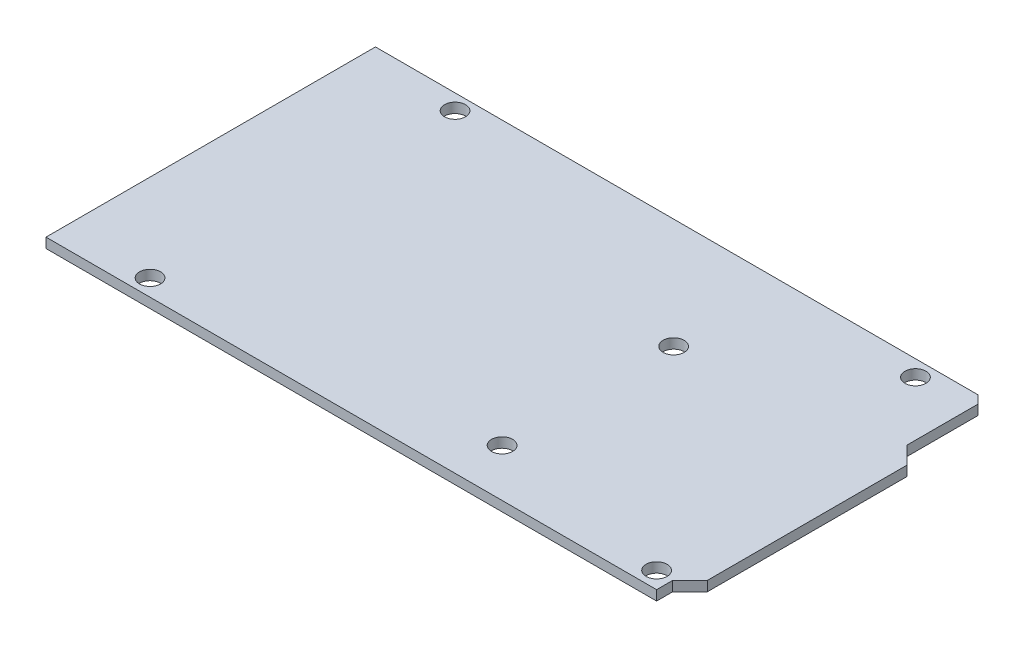
ISO-10303-21;
HEADER;
FILE_DESCRIPTION(('STEP AP214'),'2;1');
FILE_NAME('part.step','',(''),(''),'','','');
FILE_SCHEMA(('AUTOMOTIVE_DESIGN { 1 0 10303 214 1 1 1 1 }'));
ENDSEC;
DATA;
#1=APPLICATION_CONTEXT('core data for automotive mechanical design processes');
#2=APPLICATION_PROTOCOL_DEFINITION('international standard','automotive_design',2000,#1);
#3=PRODUCT_CONTEXT('',#1,'mechanical');
#4=PRODUCT('Part','Part','',(#3));
#5=PRODUCT_RELATED_PRODUCT_CATEGORY('part','',(#4));
#6=PRODUCT_DEFINITION_FORMATION('','',#4);
#7=PRODUCT_DEFINITION_CONTEXT('part definition',#1,'design');
#8=PRODUCT_DEFINITION('design','',#6,#7);
#9=PRODUCT_DEFINITION_SHAPE('','',#8);
#10=(LENGTH_UNIT() NAMED_UNIT(*) SI_UNIT(.MILLI.,.METRE.));
#11=(NAMED_UNIT(*) PLANE_ANGLE_UNIT() SI_UNIT($,.RADIAN.));
#12=(NAMED_UNIT(*) SI_UNIT($,.STERADIAN.) SOLID_ANGLE_UNIT());
#13=UNCERTAINTY_MEASURE_WITH_UNIT(LENGTH_MEASURE(1.E-05),#10,'distance_accuracy_value','');
#14=(GEOMETRIC_REPRESENTATION_CONTEXT(3) GLOBAL_UNCERTAINTY_ASSIGNED_CONTEXT((#13)) GLOBAL_UNIT_ASSIGNED_CONTEXT((#10,
#11,#12)) REPRESENTATION_CONTEXT('',''));
#15=CARTESIAN_POINT('',(0.,0.,0.));
#16=DIRECTION('',(0.,0.,1.));
#17=DIRECTION('',(1.,0.,0.));
#18=AXIS2_PLACEMENT_3D('',#15,#16,#17);
#19=CARTESIAN_POINT('',(0.,1.6,0.));
#20=DIRECTION('',(0.,-1.,0.));
#21=DIRECTION('',(0.,0.,-1.));
#22=AXIS2_PLACEMENT_3D('',#19,#20,#21);
#23=PLANE('',#22);
#24=DIRECTION('',(0.,0.,1.));
#25=VECTOR('',#24,1.);
#26=CARTESIAN_POINT('',(0.,1.6,0.));
#27=LINE('',#26,#25);
#28=CARTESIAN_POINT('',(0.,1.6,-53.2));
#29=VERTEX_POINT('',#28);
#30=CARTESIAN_POINT('',(0.,1.6,0.));
#31=VERTEX_POINT('',#30);
#32=EDGE_CURVE('E165',#29,#31,#27,.T.);
#33=ORIENTED_EDGE('',*,*,#32,.T.);
#34=DIRECTION('',(1.,0.,0.));
#35=VECTOR('',#34,1.);
#36=CARTESIAN_POINT('',(0.,1.6,0.));
#37=LINE('',#36,#35);
#38=CARTESIAN_POINT('',(98.6,1.6,0.));
#39=VERTEX_POINT('',#38);
#40=EDGE_CURVE('E104',#31,#39,#37,.T.);
#41=ORIENTED_EDGE('',*,*,#40,.T.);
#42=DIRECTION('',(0.,0.,-1.));
#43=VECTOR('',#42,1.);
#44=CARTESIAN_POINT('',(98.6,1.6,0.));
#45=LINE('',#44,#43);
#46=CARTESIAN_POINT('',(98.6,1.6,-2.6));
#47=VERTEX_POINT('',#46);
#48=EDGE_CURVE('E183',#39,#47,#45,.T.);
#49=ORIENTED_EDGE('',*,*,#48,.T.);
#50=DIRECTION('',(0.707106781186549,0.,-0.707106781186546));
#51=VECTOR('',#50,1.);
#52=CARTESIAN_POINT('',(98.6,1.6,-2.6));
#53=LINE('',#52,#51);
#54=CARTESIAN_POINT('',(101.4,1.6,-5.39999999999999));
#55=VERTEX_POINT('',#54);
#56=EDGE_CURVE('E200',#47,#55,#53,.T.);
#57=ORIENTED_EDGE('',*,*,#56,.T.);
#58=DIRECTION('',(0.,0.,-1.));
#59=VECTOR('',#58,1.);
#60=CARTESIAN_POINT('',(101.4,1.6,-5.39999999999999));
#61=LINE('',#60,#59);
#62=CARTESIAN_POINT('',(101.4,1.6,-37.6));
#63=VERTEX_POINT('',#62);
#64=EDGE_CURVE('E199',#55,#63,#61,.T.);
#65=ORIENTED_EDGE('',*,*,#64,.T.);
#66=DIRECTION('',(-0.70710678118655,0.,-0.707106781186545));
#67=VECTOR('',#66,1.);
#68=CARTESIAN_POINT('',(101.4,1.6,-37.6));
#69=LINE('',#68,#67);
#70=CARTESIAN_POINT('',(98.6,1.6,-40.4));
#71=VERTEX_POINT('',#70);
#72=EDGE_CURVE('E126',#63,#71,#69,.T.);
#73=ORIENTED_EDGE('',*,*,#72,.T.);
#74=DIRECTION('',(0.,0.,-1.));
#75=VECTOR('',#74,1.);
#76=CARTESIAN_POINT('',(98.6,1.6,-40.4));
#77=LINE('',#76,#75);
#78=CARTESIAN_POINT('',(98.6,1.6,-51.9));
#79=VERTEX_POINT('',#78);
#80=EDGE_CURVE('E120',#71,#79,#77,.T.);
#81=ORIENTED_EDGE('',*,*,#80,.T.);
#82=DIRECTION('',(-0.707106781186551,0.,-0.707106781186544));
#83=VECTOR('',#82,1.);
#84=CARTESIAN_POINT('',(98.6,1.6,-51.9));
#85=LINE('',#84,#83);
#86=CARTESIAN_POINT('',(97.3,1.6,-53.2));
#87=VERTEX_POINT('',#86);
#88=EDGE_CURVE('E124',#79,#87,#85,.T.);
#89=ORIENTED_EDGE('',*,*,#88,.T.);
#90=DIRECTION('',(-1.,0.,0.));
#91=VECTOR('',#90,1.);
#92=CARTESIAN_POINT('',(0.,1.6,-53.2));
#93=LINE('',#92,#91);
#94=EDGE_CURVE('E56',#87,#29,#93,.T.);
#95=ORIENTED_EDGE('',*,*,#94,.T.);
#96=EDGE_LOOP('',(#33,#41,#49,#57,#65,#73,#81,#89,#95));
#97=FACE_BOUND('',#96,.T.);
#98=CARTESIAN_POINT('',(95.9,1.6,-2.7));
#99=DIRECTION('',(0.,1.,0.));
#100=DIRECTION('',(0.,0.,1.));
#101=AXIS2_PLACEMENT_3D('',#98,#99,#100);
#102=CIRCLE('',#101,1.7);
#103=CARTESIAN_POINT('',(95.9,1.6,-1.));
#104=VERTEX_POINT('',#103);
#105=EDGE_CURVE('E150',#104,#104,#102,.T.);
#106=ORIENTED_EDGE('',*,*,#105,.F.);
#107=EDGE_LOOP('',(#106));
#108=FACE_BOUND('',#107,.T.);
#109=CARTESIAN_POINT('',(89.8,1.6,-50.6));
#110=DIRECTION('',(0.,1.,0.));
#111=DIRECTION('',(0.,0.,1.));
#112=AXIS2_PLACEMENT_3D('',#109,#110,#111);
#113=CIRCLE('',#112,1.7);
#114=CARTESIAN_POINT('',(89.8,1.6,-48.9));
#115=VERTEX_POINT('',#114);
#116=EDGE_CURVE('E212',#115,#115,#113,.T.);
#117=ORIENTED_EDGE('',*,*,#116,.F.);
#118=EDGE_LOOP('',(#117));
#119=FACE_BOUND('',#118,.T.);
#120=CARTESIAN_POINT('',(65.95,1.6,-35.4));
#121=DIRECTION('',(0.,1.,0.));
#122=DIRECTION('',(0.,0.,1.));
#123=AXIS2_PLACEMENT_3D('',#120,#121,#122);
#124=CIRCLE('',#123,1.7);
#125=CARTESIAN_POINT('',(65.95,1.6,-33.7));
#126=VERTEX_POINT('',#125);
#127=EDGE_CURVE('E218',#126,#126,#124,.T.);
#128=ORIENTED_EDGE('',*,*,#127,.F.);
#129=EDGE_LOOP('',(#128));
#130=FACE_BOUND('',#129,.T.);
#131=CARTESIAN_POINT('',(65.95,1.6,-7.7));
#132=DIRECTION('',(0.,1.,0.));
#133=DIRECTION('',(0.,0.,1.));
#134=AXIS2_PLACEMENT_3D('',#131,#132,#133);
#135=CIRCLE('',#134,1.7);
#136=CARTESIAN_POINT('',(65.95,1.6,-6.));
#137=VERTEX_POINT('',#136);
#138=EDGE_CURVE('E224',#137,#137,#135,.T.);
#139=ORIENTED_EDGE('',*,*,#138,.F.);
#140=EDGE_LOOP('',(#139));
#141=FACE_BOUND('',#140,.T.);
#142=CARTESIAN_POINT('',(15.35,1.6,-50.7));
#143=DIRECTION('',(0.,1.,0.));
#144=DIRECTION('',(0.,0.,1.));
#145=AXIS2_PLACEMENT_3D('',#142,#143,#144);
#146=CIRCLE('',#145,1.7);
#147=CARTESIAN_POINT('',(15.35,1.6,-49.));
#148=VERTEX_POINT('',#147);
#149=EDGE_CURVE('E230',#148,#148,#146,.T.);
#150=ORIENTED_EDGE('',*,*,#149,.F.);
#151=EDGE_LOOP('',(#150));
#152=FACE_BOUND('',#151,.T.);
#153=CARTESIAN_POINT('',(14.1,1.6,-2.7));
#154=DIRECTION('',(0.,1.,0.));
#155=DIRECTION('',(0.,0.,1.));
#156=AXIS2_PLACEMENT_3D('',#153,#154,#155);
#157=CIRCLE('',#156,1.7);
#158=CARTESIAN_POINT('',(14.1,1.6,-1.));
#159=VERTEX_POINT('',#158);
#160=EDGE_CURVE('E236',#159,#159,#157,.T.);
#161=ORIENTED_EDGE('',*,*,#160,.F.);
#162=EDGE_LOOP('',(#161));
#163=FACE_BOUND('',#162,.T.);
#164=ADVANCED_FACE('F38',(#97,#108,#119,#130,#141,#152,#163),#23,.F.);
#165=CARTESIAN_POINT('',(0.,0.,0.));
#166=DIRECTION('',(0.,-1.,0.));
#167=DIRECTION('',(0.,0.,-1.));
#168=AXIS2_PLACEMENT_3D('',#165,#166,#167);
#169=PLANE('',#168);
#170=CARTESIAN_POINT('',(15.35,0.,-50.7));
#171=DIRECTION('',(0.,1.,0.));
#172=DIRECTION('',(0.,0.,1.));
#173=AXIS2_PLACEMENT_3D('',#170,#171,#172);
#174=CIRCLE('',#173,1.7);
#175=CARTESIAN_POINT('',(15.35,0.,-49.));
#176=VERTEX_POINT('',#175);
#177=EDGE_CURVE('E233',#176,#176,#174,.T.);
#178=ORIENTED_EDGE('',*,*,#177,.T.);
#179=EDGE_LOOP('',(#178));
#180=FACE_BOUND('',#179,.T.);
#181=CARTESIAN_POINT('',(65.95,0.,-35.4));
#182=DIRECTION('',(0.,1.,0.));
#183=DIRECTION('',(0.,0.,1.));
#184=AXIS2_PLACEMENT_3D('',#181,#182,#183);
#185=CIRCLE('',#184,1.7);
#186=CARTESIAN_POINT('',(65.95,0.,-33.7));
#187=VERTEX_POINT('',#186);
#188=EDGE_CURVE('E221',#187,#187,#185,.T.);
#189=ORIENTED_EDGE('',*,*,#188,.T.);
#190=EDGE_LOOP('',(#189));
#191=FACE_BOUND('',#190,.T.);
#192=CARTESIAN_POINT('',(95.9,0.,-2.7));
#193=DIRECTION('',(0.,1.,0.));
#194=DIRECTION('',(0.,0.,1.));
#195=AXIS2_PLACEMENT_3D('',#192,#193,#194);
#196=CIRCLE('',#195,1.7);
#197=CARTESIAN_POINT('',(95.9,0.,-1.));
#198=VERTEX_POINT('',#197);
#199=EDGE_CURVE('E209',#198,#198,#196,.T.);
#200=ORIENTED_EDGE('',*,*,#199,.T.);
#201=EDGE_LOOP('',(#200));
#202=FACE_BOUND('',#201,.T.);
#203=DIRECTION('',(0.,0.,1.));
#204=VECTOR('',#203,1.);
#205=CARTESIAN_POINT('',(0.,0.,0.));
#206=LINE('',#205,#204);
#207=CARTESIAN_POINT('',(0.,0.,-53.2));
#208=VERTEX_POINT('',#207);
#209=CARTESIAN_POINT('',(0.,0.,0.));
#210=VERTEX_POINT('',#209);
#211=EDGE_CURVE('E145',#208,#210,#206,.T.);
#212=ORIENTED_EDGE('',*,*,#211,.F.);
#213=DIRECTION('',(-1.,0.,0.));
#214=VECTOR('',#213,1.);
#215=CARTESIAN_POINT('',(0.,0.,-53.2));
#216=LINE('',#215,#214);
#217=CARTESIAN_POINT('',(97.3,0.,-53.2));
#218=VERTEX_POINT('',#217);
#219=EDGE_CURVE('E95',#218,#208,#216,.T.);
#220=ORIENTED_EDGE('',*,*,#219,.F.);
#221=DIRECTION('',(-0.707106781186551,0.,-0.707106781186544));
#222=VECTOR('',#221,1.);
#223=CARTESIAN_POINT('',(98.6,0.,-51.9));
#224=LINE('',#223,#222);
#225=CARTESIAN_POINT('',(98.6,0.,-51.9));
#226=VERTEX_POINT('',#225);
#227=EDGE_CURVE('E89',#226,#218,#224,.T.);
#228=ORIENTED_EDGE('',*,*,#227,.F.);
#229=DIRECTION('',(0.,0.,-1.));
#230=VECTOR('',#229,1.);
#231=CARTESIAN_POINT('',(98.6,0.,-40.4));
#232=LINE('',#231,#230);
#233=CARTESIAN_POINT('',(98.6,0.,-40.4));
#234=VERTEX_POINT('',#233);
#235=EDGE_CURVE('E134',#234,#226,#232,.T.);
#236=ORIENTED_EDGE('',*,*,#235,.F.);
#237=DIRECTION('',(-0.70710678118655,0.,-0.707106781186545));
#238=VECTOR('',#237,1.);
#239=CARTESIAN_POINT('',(101.4,0.,-37.6));
#240=LINE('',#239,#238);
#241=CARTESIAN_POINT('',(101.4,0.,-37.6));
#242=VERTEX_POINT('',#241);
#243=EDGE_CURVE('E159',#242,#234,#240,.T.);
#244=ORIENTED_EDGE('',*,*,#243,.F.);
#245=DIRECTION('',(0.,0.,-1.));
#246=VECTOR('',#245,1.);
#247=CARTESIAN_POINT('',(101.4,0.,-5.39999999999999));
#248=LINE('',#247,#246);
#249=CARTESIAN_POINT('',(101.4,0.,-5.39999999999999));
#250=VERTEX_POINT('',#249);
#251=EDGE_CURVE('E157',#250,#242,#248,.T.);
#252=ORIENTED_EDGE('',*,*,#251,.F.);
#253=DIRECTION('',(0.707106781186549,0.,-0.707106781186546));
#254=VECTOR('',#253,1.);
#255=CARTESIAN_POINT('',(98.6,0.,-2.6));
#256=LINE('',#255,#254);
#257=CARTESIAN_POINT('',(98.6,0.,-2.6));
#258=VERTEX_POINT('',#257);
#259=EDGE_CURVE('E155',#258,#250,#256,.T.);
#260=ORIENTED_EDGE('',*,*,#259,.F.);
#261=DIRECTION('',(0.,0.,-1.));
#262=VECTOR('',#261,1.);
#263=CARTESIAN_POINT('',(98.6,0.,0.));
#264=LINE('',#263,#262);
#265=CARTESIAN_POINT('',(98.6,0.,0.));
#266=VERTEX_POINT('',#265);
#267=EDGE_CURVE('E153',#266,#258,#264,.T.);
#268=ORIENTED_EDGE('',*,*,#267,.F.);
#269=DIRECTION('',(1.,0.,0.));
#270=VECTOR('',#269,1.);
#271=CARTESIAN_POINT('',(0.,0.,0.));
#272=LINE('',#271,#270);
#273=EDGE_CURVE('E149',#210,#266,#272,.T.);
#274=ORIENTED_EDGE('',*,*,#273,.F.);
#275=EDGE_LOOP('',(#212,#220,#228,#236,#244,#252,#260,#268,#274));
#276=FACE_BOUND('',#275,.T.);
#277=CARTESIAN_POINT('',(89.8,0.,-50.6));
#278=DIRECTION('',(0.,1.,0.));
#279=DIRECTION('',(0.,0.,1.));
#280=AXIS2_PLACEMENT_3D('',#277,#278,#279);
#281=CIRCLE('',#280,1.7);
#282=CARTESIAN_POINT('',(89.8,0.,-48.9));
#283=VERTEX_POINT('',#282);
#284=EDGE_CURVE('E215',#283,#283,#281,.T.);
#285=ORIENTED_EDGE('',*,*,#284,.T.);
#286=EDGE_LOOP('',(#285));
#287=FACE_BOUND('',#286,.T.);
#288=CARTESIAN_POINT('',(65.95,0.,-7.7));
#289=DIRECTION('',(0.,1.,0.));
#290=DIRECTION('',(0.,0.,1.));
#291=AXIS2_PLACEMENT_3D('',#288,#289,#290);
#292=CIRCLE('',#291,1.7);
#293=CARTESIAN_POINT('',(65.95,0.,-6.));
#294=VERTEX_POINT('',#293);
#295=EDGE_CURVE('E227',#294,#294,#292,.T.);
#296=ORIENTED_EDGE('',*,*,#295,.T.);
#297=EDGE_LOOP('',(#296));
#298=FACE_BOUND('',#297,.T.);
#299=CARTESIAN_POINT('',(14.1,0.,-2.7));
#300=DIRECTION('',(0.,1.,0.));
#301=DIRECTION('',(0.,0.,1.));
#302=AXIS2_PLACEMENT_3D('',#299,#300,#301);
#303=CIRCLE('',#302,1.7);
#304=CARTESIAN_POINT('',(14.1,0.,-1.));
#305=VERTEX_POINT('',#304);
#306=EDGE_CURVE('E239',#305,#305,#303,.T.);
#307=ORIENTED_EDGE('',*,*,#306,.T.);
#308=EDGE_LOOP('',(#307));
#309=FACE_BOUND('',#308,.T.);
#310=ADVANCED_FACE('F187',(#180,#191,#202,#276,#287,#298,#309),#169,.T.);
#311=CARTESIAN_POINT('',(0.,1.6,0.));
#312=DIRECTION('',(1.,0.,0.));
#313=DIRECTION('',(0.,0.,-1.));
#314=AXIS2_PLACEMENT_3D('',#311,#312,#313);
#315=PLANE('',#314);
#316=ORIENTED_EDGE('',*,*,#211,.T.);
#317=DIRECTION('',(0.,-1.,0.));
#318=VECTOR('',#317,1.);
#319=CARTESIAN_POINT('',(0.,1.6,0.));
#320=LINE('',#319,#318);
#321=EDGE_CURVE('E11',#31,#210,#320,.T.);
#322=ORIENTED_EDGE('',*,*,#321,.F.);
#323=ORIENTED_EDGE('',*,*,#32,.F.);
#324=DIRECTION('',(0.,-1.,0.));
#325=VECTOR('',#324,1.);
#326=CARTESIAN_POINT('',(0.,1.6,-53.2));
#327=LINE('',#326,#325);
#328=EDGE_CURVE('E141',#29,#208,#327,.T.);
#329=ORIENTED_EDGE('',*,*,#328,.T.);
#330=EDGE_LOOP('',(#316,#322,#323,#329));
#331=FACE_BOUND('',#330,.T.);
#332=ADVANCED_FACE('F40',(#331),#315,.F.);
#333=CARTESIAN_POINT('',(0.,1.6,0.));
#334=DIRECTION('',(0.,0.,-1.));
#335=DIRECTION('',(-1.,0.,0.));
#336=AXIS2_PLACEMENT_3D('',#333,#334,#335);
#337=PLANE('',#336);
#338=ORIENTED_EDGE('',*,*,#273,.T.);
#339=DIRECTION('',(0.,-1.,0.));
#340=VECTOR('',#339,1.);
#341=CARTESIAN_POINT('',(98.6,1.6,0.));
#342=LINE('',#341,#340);
#343=EDGE_CURVE('E48',#39,#266,#342,.T.);
#344=ORIENTED_EDGE('',*,*,#343,.F.);
#345=ORIENTED_EDGE('',*,*,#40,.F.);
#346=ORIENTED_EDGE('',*,*,#321,.T.);
#347=EDGE_LOOP('',(#338,#344,#345,#346));
#348=FACE_BOUND('',#347,.T.);
#349=ADVANCED_FACE('F277',(#348),#337,.F.);
#350=CARTESIAN_POINT('',(98.6,1.6,0.));
#351=DIRECTION('',(-1.,0.,0.));
#352=DIRECTION('',(0.,0.,1.));
#353=AXIS2_PLACEMENT_3D('',#350,#351,#352);
#354=PLANE('',#353);
#355=ORIENTED_EDGE('',*,*,#267,.T.);
#356=DIRECTION('',(0.,-1.,0.));
#357=VECTOR('',#356,1.);
#358=CARTESIAN_POINT('',(98.6,1.6,-2.6));
#359=LINE('',#358,#357);
#360=EDGE_CURVE('E175',#47,#258,#359,.T.);
#361=ORIENTED_EDGE('',*,*,#360,.F.);
#362=ORIENTED_EDGE('',*,*,#48,.F.);
#363=ORIENTED_EDGE('',*,*,#343,.T.);
#364=EDGE_LOOP('',(#355,#361,#362,#363));
#365=FACE_BOUND('',#364,.T.);
#366=ADVANCED_FACE('F181',(#365),#354,.F.);
#367=CARTESIAN_POINT('',(98.6,1.6,-2.6));
#368=DIRECTION('',(-0.707106781186546,0.,-0.707106781186549));
#369=DIRECTION('',(-0.707106781186549,0.,0.707106781186546));
#370=AXIS2_PLACEMENT_3D('',#367,#368,#369);
#371=PLANE('',#370);
#372=ORIENTED_EDGE('',*,*,#259,.T.);
#373=DIRECTION('',(0.,-1.,0.));
#374=VECTOR('',#373,1.);
#375=CARTESIAN_POINT('',(101.4,1.6,-5.39999999999999));
#376=LINE('',#375,#374);
#377=EDGE_CURVE('E172',#55,#250,#376,.T.);
#378=ORIENTED_EDGE('',*,*,#377,.F.);
#379=ORIENTED_EDGE('',*,*,#56,.F.);
#380=ORIENTED_EDGE('',*,*,#360,.T.);
#381=EDGE_LOOP('',(#372,#378,#379,#380));
#382=FACE_BOUND('',#381,.T.);
#383=ADVANCED_FACE('F193',(#382),#371,.F.);
#384=CARTESIAN_POINT('',(101.4,1.6,-5.39999999999999));
#385=DIRECTION('',(-1.,0.,0.));
#386=DIRECTION('',(0.,0.,1.));
#387=AXIS2_PLACEMENT_3D('',#384,#385,#386);
#388=PLANE('',#387);
#389=ORIENTED_EDGE('',*,*,#251,.T.);
#390=DIRECTION('',(0.,-1.,0.));
#391=VECTOR('',#390,1.);
#392=CARTESIAN_POINT('',(101.4,1.6,-37.6));
#393=LINE('',#392,#391);
#394=EDGE_CURVE('E169',#63,#242,#393,.T.);
#395=ORIENTED_EDGE('',*,*,#394,.F.);
#396=ORIENTED_EDGE('',*,*,#64,.F.);
#397=ORIENTED_EDGE('',*,*,#377,.T.);
#398=EDGE_LOOP('',(#389,#395,#396,#397));
#399=FACE_BOUND('',#398,.T.);
#400=ADVANCED_FACE('F197',(#399),#388,.F.);
#401=CARTESIAN_POINT('',(101.4,1.6,-37.6));
#402=DIRECTION('',(-0.707106781186545,0.,0.70710678118655));
#403=DIRECTION('',(0.70710678118655,0.,0.707106781186545));
#404=AXIS2_PLACEMENT_3D('',#401,#402,#403);
#405=PLANE('',#404);
#406=ORIENTED_EDGE('',*,*,#243,.T.);
#407=DIRECTION('',(0.,-1.,0.));
#408=VECTOR('',#407,1.);
#409=CARTESIAN_POINT('',(98.6,1.6,-40.4));
#410=LINE('',#409,#408);
#411=EDGE_CURVE('E135',#71,#234,#410,.T.);
#412=ORIENTED_EDGE('',*,*,#411,.F.);
#413=ORIENTED_EDGE('',*,*,#72,.F.);
#414=ORIENTED_EDGE('',*,*,#394,.T.);
#415=EDGE_LOOP('',(#406,#412,#413,#414));
#416=FACE_BOUND('',#415,.T.);
#417=ADVANCED_FACE('F268',(#416),#405,.F.);
#418=CARTESIAN_POINT('',(98.6,1.6,-40.4));
#419=DIRECTION('',(-1.,0.,0.));
#420=DIRECTION('',(0.,0.,1.));
#421=AXIS2_PLACEMENT_3D('',#418,#419,#420);
#422=PLANE('',#421);
#423=ORIENTED_EDGE('',*,*,#235,.T.);
#424=DIRECTION('',(0.,-1.,0.));
#425=VECTOR('',#424,1.);
#426=CARTESIAN_POINT('',(98.6,1.6,-51.9));
#427=LINE('',#426,#425);
#428=EDGE_CURVE('E131',#79,#226,#427,.T.);
#429=ORIENTED_EDGE('',*,*,#428,.F.);
#430=ORIENTED_EDGE('',*,*,#80,.F.);
#431=ORIENTED_EDGE('',*,*,#411,.T.);
#432=EDGE_LOOP('',(#423,#429,#430,#431));
#433=FACE_BOUND('',#432,.T.);
#434=ADVANCED_FACE('F132',(#433),#422,.F.);
#435=CARTESIAN_POINT('',(98.6,1.6,-51.9));
#436=DIRECTION('',(-0.707106781186544,0.,0.707106781186551));
#437=DIRECTION('',(0.707106781186551,0.,0.707106781186544));
#438=AXIS2_PLACEMENT_3D('',#435,#436,#437);
#439=PLANE('',#438);
#440=ORIENTED_EDGE('',*,*,#227,.T.);
#441=DIRECTION('',(0.,-1.,0.));
#442=VECTOR('',#441,1.);
#443=CARTESIAN_POINT('',(97.3,1.6,-53.2));
#444=LINE('',#443,#442);
#445=EDGE_CURVE('E136',#87,#218,#444,.T.);
#446=ORIENTED_EDGE('',*,*,#445,.F.);
#447=ORIENTED_EDGE('',*,*,#88,.F.);
#448=ORIENTED_EDGE('',*,*,#428,.T.);
#449=EDGE_LOOP('',(#440,#446,#447,#448));
#450=FACE_BOUND('',#449,.T.);
#451=ADVANCED_FACE('F138',(#450),#439,.F.);
#452=CARTESIAN_POINT('',(0.,1.6,-53.2));
#453=DIRECTION('',(0.,0.,1.));
#454=DIRECTION('',(1.,0.,0.));
#455=AXIS2_PLACEMENT_3D('',#452,#453,#454);
#456=PLANE('',#455);
#457=ORIENTED_EDGE('',*,*,#219,.T.);
#458=ORIENTED_EDGE('',*,*,#328,.F.);
#459=ORIENTED_EDGE('',*,*,#94,.F.);
#460=ORIENTED_EDGE('',*,*,#445,.T.);
#461=EDGE_LOOP('',(#457,#458,#459,#460));
#462=FACE_BOUND('',#461,.T.);
#463=ADVANCED_FACE('F261',(#462),#456,.F.);
#464=CARTESIAN_POINT('',(95.9,1.6,-2.7));
#465=DIRECTION('',(0.,-1.,0.));
#466=DIRECTION('',(0.,0.,-1.));
#467=AXIS2_PLACEMENT_3D('',#464,#465,#466);
#468=CYLINDRICAL_SURFACE('',#467,1.7);
#469=ORIENTED_EDGE('',*,*,#105,.T.);
#470=EDGE_LOOP('',(#469));
#471=FACE_BOUND('',#470,.T.);
#472=ORIENTED_EDGE('',*,*,#199,.F.);
#473=EDGE_LOOP('',(#472));
#474=FACE_BOUND('',#473,.T.);
#475=ADVANCED_FACE('F258',(#471,#474),#468,.F.);
#476=CARTESIAN_POINT('',(89.8,1.6,-50.6));
#477=DIRECTION('',(0.,-1.,0.));
#478=DIRECTION('',(0.,0.,-1.));
#479=AXIS2_PLACEMENT_3D('',#476,#477,#478);
#480=CYLINDRICAL_SURFACE('',#479,1.7);
#481=ORIENTED_EDGE('',*,*,#116,.T.);
#482=EDGE_LOOP('',(#481));
#483=FACE_BOUND('',#482,.T.);
#484=ORIENTED_EDGE('',*,*,#284,.F.);
#485=EDGE_LOOP('',(#484));
#486=FACE_BOUND('',#485,.T.);
#487=ADVANCED_FACE('F349',(#483,#486),#480,.F.);
#488=CARTESIAN_POINT('',(65.95,1.6,-35.4));
#489=DIRECTION('',(0.,-1.,0.));
#490=DIRECTION('',(0.,0.,-1.));
#491=AXIS2_PLACEMENT_3D('',#488,#489,#490);
#492=CYLINDRICAL_SURFACE('',#491,1.7);
#493=ORIENTED_EDGE('',*,*,#127,.T.);
#494=EDGE_LOOP('',(#493));
#495=FACE_BOUND('',#494,.T.);
#496=ORIENTED_EDGE('',*,*,#188,.F.);
#497=EDGE_LOOP('',(#496));
#498=FACE_BOUND('',#497,.T.);
#499=ADVANCED_FACE('F357',(#495,#498),#492,.F.);
#500=CARTESIAN_POINT('',(65.95,1.6,-7.7));
#501=DIRECTION('',(0.,-1.,0.));
#502=DIRECTION('',(0.,0.,-1.));
#503=AXIS2_PLACEMENT_3D('',#500,#501,#502);
#504=CYLINDRICAL_SURFACE('',#503,1.7);
#505=ORIENTED_EDGE('',*,*,#138,.T.);
#506=EDGE_LOOP('',(#505));
#507=FACE_BOUND('',#506,.T.);
#508=ORIENTED_EDGE('',*,*,#295,.F.);
#509=EDGE_LOOP('',(#508));
#510=FACE_BOUND('',#509,.T.);
#511=ADVANCED_FACE('F365',(#507,#510),#504,.F.);
#512=CARTESIAN_POINT('',(15.35,1.6,-50.7));
#513=DIRECTION('',(0.,-1.,0.));
#514=DIRECTION('',(0.,0.,-1.));
#515=AXIS2_PLACEMENT_3D('',#512,#513,#514);
#516=CYLINDRICAL_SURFACE('',#515,1.7);
#517=ORIENTED_EDGE('',*,*,#149,.T.);
#518=EDGE_LOOP('',(#517));
#519=FACE_BOUND('',#518,.T.);
#520=ORIENTED_EDGE('',*,*,#177,.F.);
#521=EDGE_LOOP('',(#520));
#522=FACE_BOUND('',#521,.T.);
#523=ADVANCED_FACE('F374',(#519,#522),#516,.F.);
#524=CARTESIAN_POINT('',(14.1,1.6,-2.7));
#525=DIRECTION('',(0.,-1.,0.));
#526=DIRECTION('',(0.,0.,-1.));
#527=AXIS2_PLACEMENT_3D('',#524,#525,#526);
#528=CYLINDRICAL_SURFACE('',#527,1.7);
#529=ORIENTED_EDGE('',*,*,#160,.T.);
#530=EDGE_LOOP('',(#529));
#531=FACE_BOUND('',#530,.T.);
#532=ORIENTED_EDGE('',*,*,#306,.F.);
#533=EDGE_LOOP('',(#532));
#534=FACE_BOUND('',#533,.T.);
#535=ADVANCED_FACE('F247',(#531,#534),#528,.F.);
#536=CLOSED_SHELL('',(#164,#310,#332,#349,#366,#383,#400,#417,#434,#451,#463,#475,#487,#499,
#511,#523,#535));
#537=MANIFOLD_SOLID_BREP('B2',#536);
#538=ADVANCED_BREP_SHAPE_REPRESENTATION('',(#18,#537),#14);
#539=SHAPE_DEFINITION_REPRESENTATION(#9,#538);
ENDSEC;
END-ISO-10303-21;
